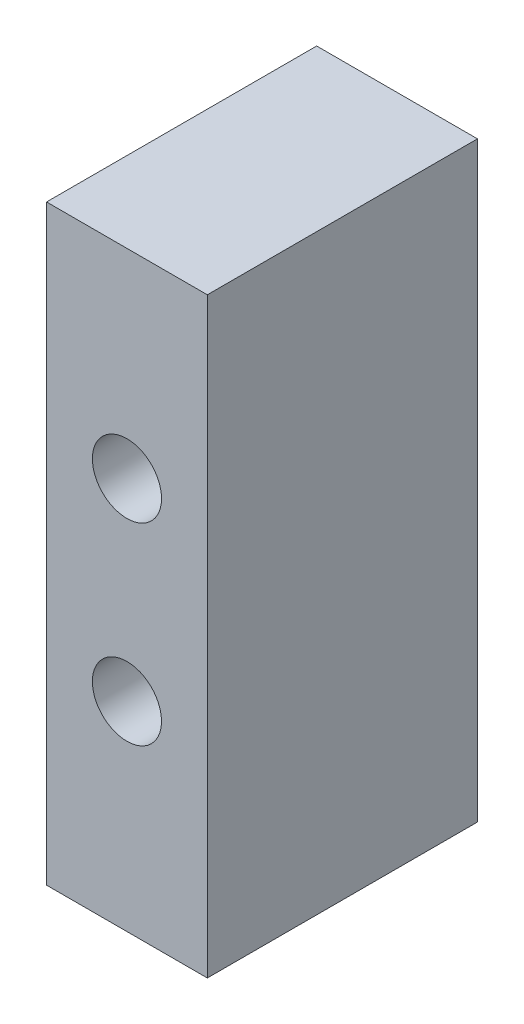
ISO-10303-21;
HEADER;
FILE_DESCRIPTION(('STEP AP214'),'2;1');
FILE_NAME('part.step','',(''),(''),'','','');
FILE_SCHEMA(('AUTOMOTIVE_DESIGN { 1 0 10303 214 1 1 1 1 }'));
ENDSEC;
DATA;
#1=APPLICATION_CONTEXT('core data for automotive mechanical design processes');
#2=APPLICATION_PROTOCOL_DEFINITION('international standard','automotive_design',2000,#1);
#3=PRODUCT_CONTEXT('',#1,'mechanical');
#4=PRODUCT('Part','Part','',(#3));
#5=PRODUCT_RELATED_PRODUCT_CATEGORY('part','',(#4));
#6=PRODUCT_DEFINITION_FORMATION('','',#4);
#7=PRODUCT_DEFINITION_CONTEXT('part definition',#1,'design');
#8=PRODUCT_DEFINITION('design','',#6,#7);
#9=PRODUCT_DEFINITION_SHAPE('','',#8);
#10=(LENGTH_UNIT() NAMED_UNIT(*) SI_UNIT(.MILLI.,.METRE.));
#11=(NAMED_UNIT(*) PLANE_ANGLE_UNIT() SI_UNIT($,.RADIAN.));
#12=(NAMED_UNIT(*) SI_UNIT($,.STERADIAN.) SOLID_ANGLE_UNIT());
#13=UNCERTAINTY_MEASURE_WITH_UNIT(LENGTH_MEASURE(1.E-05),#10,'distance_accuracy_value','');
#14=(GEOMETRIC_REPRESENTATION_CONTEXT(3) GLOBAL_UNCERTAINTY_ASSIGNED_CONTEXT((#13)) GLOBAL_UNIT_ASSIGNED_CONTEXT((#10,
#11,#12)) REPRESENTATION_CONTEXT('',''));
#15=CARTESIAN_POINT('',(0.,0.,0.));
#16=DIRECTION('',(0.,0.,1.));
#17=DIRECTION('',(1.,0.,0.));
#18=AXIS2_PLACEMENT_3D('',#15,#16,#17);
#19=CARTESIAN_POINT('',(0.,0.,16.8));
#20=DIRECTION('',(0.,0.,1.));
#21=DIRECTION('',(1.,0.,0.));
#22=AXIS2_PLACEMENT_3D('',#19,#20,#21);
#23=PLANE('',#22);
#24=CARTESIAN_POINT('',(0.,6.,16.8));
#25=DIRECTION('',(0.,0.,1.));
#26=DIRECTION('',(1.,0.,0.));
#27=AXIS2_PLACEMENT_3D('',#24,#25,#26);
#28=CIRCLE('',#27,2.15);
#29=CARTESIAN_POINT('',(2.15,6.,16.8));
#30=VERTEX_POINT('',#29);
#31=EDGE_CURVE('E108',#30,#30,#28,.T.);
#32=ORIENTED_EDGE('',*,*,#31,.F.);
#33=EDGE_LOOP('',(#32));
#34=FACE_BOUND('',#33,.T.);
#35=DIRECTION('',(0.,1.,0.));
#36=VECTOR('',#35,1.);
#37=CARTESIAN_POINT('',(5.,18.4,16.8));
#38=LINE('',#37,#36);
#39=CARTESIAN_POINT('',(5.,-18.4,16.8));
#40=VERTEX_POINT('',#39);
#41=CARTESIAN_POINT('',(5.,18.4,16.8));
#42=VERTEX_POINT('',#41);
#43=EDGE_CURVE('E93',#40,#42,#38,.T.);
#44=ORIENTED_EDGE('',*,*,#43,.T.);
#45=DIRECTION('',(-1.,0.,0.));
#46=VECTOR('',#45,1.);
#47=CARTESIAN_POINT('',(-5.,18.4,16.8));
#48=LINE('',#47,#46);
#49=CARTESIAN_POINT('',(-5.,18.4,16.8));
#50=VERTEX_POINT('',#49);
#51=EDGE_CURVE('E88',#42,#50,#48,.T.);
#52=ORIENTED_EDGE('',*,*,#51,.T.);
#53=DIRECTION('',(0.,-1.,0.));
#54=VECTOR('',#53,1.);
#55=CARTESIAN_POINT('',(-5.,18.4,16.8));
#56=LINE('',#55,#54);
#57=CARTESIAN_POINT('',(-5.,-18.4,16.8));
#58=VERTEX_POINT('',#57);
#59=EDGE_CURVE('E91',#50,#58,#56,.T.);
#60=ORIENTED_EDGE('',*,*,#59,.T.);
#61=DIRECTION('',(1.,0.,0.));
#62=VECTOR('',#61,1.);
#63=CARTESIAN_POINT('',(-5.,-18.4,16.8));
#64=LINE('',#63,#62);
#65=EDGE_CURVE('E58',#58,#40,#64,.T.);
#66=ORIENTED_EDGE('',*,*,#65,.T.);
#67=EDGE_LOOP('',(#44,#52,#60,#66));
#68=FACE_BOUND('',#67,.T.);
#69=CARTESIAN_POINT('',(0.,-6.,16.8));
#70=DIRECTION('',(0.,0.,1.));
#71=DIRECTION('',(-1.,0.,0.));
#72=AXIS2_PLACEMENT_3D('',#69,#70,#71);
#73=CIRCLE('',#72,2.15);
#74=CARTESIAN_POINT('',(-2.15,-6.,16.8));
#75=VERTEX_POINT('',#74);
#76=EDGE_CURVE('E123',#75,#75,#73,.T.);
#77=ORIENTED_EDGE('',*,*,#76,.F.);
#78=EDGE_LOOP('',(#77));
#79=FACE_BOUND('',#78,.T.);
#80=ADVANCED_FACE('F41',(#34,#68,#79),#23,.T.);
#81=CARTESIAN_POINT('',(0.,0.,0.));
#82=DIRECTION('',(0.,0.,1.));
#83=DIRECTION('',(1.,0.,0.));
#84=AXIS2_PLACEMENT_3D('',#81,#82,#83);
#85=PLANE('',#84);
#86=DIRECTION('',(0.,1.,0.));
#87=VECTOR('',#86,1.);
#88=CARTESIAN_POINT('',(5.,18.4,0.));
#89=LINE('',#88,#87);
#90=CARTESIAN_POINT('',(5.,-18.4,0.));
#91=VERTEX_POINT('',#90);
#92=CARTESIAN_POINT('',(5.,18.4,0.));
#93=VERTEX_POINT('',#92);
#94=EDGE_CURVE('E105',#91,#93,#89,.T.);
#95=ORIENTED_EDGE('',*,*,#94,.F.);
#96=DIRECTION('',(1.,0.,0.));
#97=VECTOR('',#96,1.);
#98=CARTESIAN_POINT('',(-5.,-18.4,0.));
#99=LINE('',#98,#97);
#100=CARTESIAN_POINT('',(-5.,-18.4,0.));
#101=VERTEX_POINT('',#100);
#102=EDGE_CURVE('E81',#101,#91,#99,.T.);
#103=ORIENTED_EDGE('',*,*,#102,.F.);
#104=DIRECTION('',(0.,-1.,0.));
#105=VECTOR('',#104,1.);
#106=CARTESIAN_POINT('',(-5.,18.4,0.));
#107=LINE('',#106,#105);
#108=CARTESIAN_POINT('',(-5.,18.4,0.));
#109=VERTEX_POINT('',#108);
#110=EDGE_CURVE('E75',#109,#101,#107,.T.);
#111=ORIENTED_EDGE('',*,*,#110,.F.);
#112=DIRECTION('',(-1.,0.,0.));
#113=VECTOR('',#112,1.);
#114=CARTESIAN_POINT('',(-5.,18.4,0.));
#115=LINE('',#114,#113);
#116=EDGE_CURVE('E97',#93,#109,#115,.T.);
#117=ORIENTED_EDGE('',*,*,#116,.F.);
#118=EDGE_LOOP('',(#95,#103,#111,#117));
#119=FACE_BOUND('',#118,.T.);
#120=CARTESIAN_POINT('',(0.,6.,0.));
#121=DIRECTION('',(0.,0.,1.));
#122=DIRECTION('',(1.,0.,0.));
#123=AXIS2_PLACEMENT_3D('',#120,#121,#122);
#124=CIRCLE('',#123,2.15);
#125=CARTESIAN_POINT('',(2.15,6.,0.));
#126=VERTEX_POINT('',#125);
#127=EDGE_CURVE('E120',#126,#126,#124,.T.);
#128=ORIENTED_EDGE('',*,*,#127,.T.);
#129=EDGE_LOOP('',(#128));
#130=FACE_BOUND('',#129,.T.);
#131=CARTESIAN_POINT('',(0.,-6.,0.));
#132=DIRECTION('',(0.,0.,1.));
#133=DIRECTION('',(-1.,0.,0.));
#134=AXIS2_PLACEMENT_3D('',#131,#132,#133);
#135=CIRCLE('',#134,2.15);
#136=CARTESIAN_POINT('',(-2.15,-6.,0.));
#137=VERTEX_POINT('',#136);
#138=EDGE_CURVE('E126',#137,#137,#135,.T.);
#139=ORIENTED_EDGE('',*,*,#138,.T.);
#140=EDGE_LOOP('',(#139));
#141=FACE_BOUND('',#140,.T.);
#142=ADVANCED_FACE('F116',(#119,#130,#141),#85,.F.);
#143=CARTESIAN_POINT('',(5.,18.4,16.8));
#144=DIRECTION('',(-1.,0.,0.));
#145=DIRECTION('',(0.,-1.,0.));
#146=AXIS2_PLACEMENT_3D('',#143,#144,#145);
#147=PLANE('',#146);
#148=ORIENTED_EDGE('',*,*,#94,.T.);
#149=DIRECTION('',(0.,0.,-1.));
#150=VECTOR('',#149,1.);
#151=CARTESIAN_POINT('',(5.,18.4,16.8));
#152=LINE('',#151,#150);
#153=EDGE_CURVE('E11',#42,#93,#152,.T.);
#154=ORIENTED_EDGE('',*,*,#153,.F.);
#155=ORIENTED_EDGE('',*,*,#43,.F.);
#156=DIRECTION('',(0.,0.,-1.));
#157=VECTOR('',#156,1.);
#158=CARTESIAN_POINT('',(5.,-18.4,16.8));
#159=LINE('',#158,#157);
#160=EDGE_CURVE('E101',#40,#91,#159,.T.);
#161=ORIENTED_EDGE('',*,*,#160,.T.);
#162=EDGE_LOOP('',(#148,#154,#155,#161));
#163=FACE_BOUND('',#162,.T.);
#164=ADVANCED_FACE('F43',(#163),#147,.F.);
#165=CARTESIAN_POINT('',(-5.,18.4,16.8));
#166=DIRECTION('',(0.,-1.,0.));
#167=DIRECTION('',(0.,0.,-1.));
#168=AXIS2_PLACEMENT_3D('',#165,#166,#167);
#169=PLANE('',#168);
#170=ORIENTED_EDGE('',*,*,#116,.T.);
#171=DIRECTION('',(0.,0.,-1.));
#172=VECTOR('',#171,1.);
#173=CARTESIAN_POINT('',(-5.,18.4,16.8));
#174=LINE('',#173,#172);
#175=EDGE_CURVE('E50',#50,#109,#174,.T.);
#176=ORIENTED_EDGE('',*,*,#175,.F.);
#177=ORIENTED_EDGE('',*,*,#51,.F.);
#178=ORIENTED_EDGE('',*,*,#153,.T.);
#179=EDGE_LOOP('',(#170,#176,#177,#178));
#180=FACE_BOUND('',#179,.T.);
#181=ADVANCED_FACE('F96',(#180),#169,.F.);
#182=CARTESIAN_POINT('',(-5.,18.4,16.8));
#183=DIRECTION('',(1.,0.,0.));
#184=DIRECTION('',(0.,1.,0.));
#185=AXIS2_PLACEMENT_3D('',#182,#183,#184);
#186=PLANE('',#185);
#187=ORIENTED_EDGE('',*,*,#110,.T.);
#188=DIRECTION('',(0.,0.,-1.));
#189=VECTOR('',#188,1.);
#190=CARTESIAN_POINT('',(-5.,-18.4,16.8));
#191=LINE('',#190,#189);
#192=EDGE_CURVE('E98',#58,#101,#191,.T.);
#193=ORIENTED_EDGE('',*,*,#192,.F.);
#194=ORIENTED_EDGE('',*,*,#59,.F.);
#195=ORIENTED_EDGE('',*,*,#175,.T.);
#196=EDGE_LOOP('',(#187,#193,#194,#195));
#197=FACE_BOUND('',#196,.T.);
#198=ADVANCED_FACE('F99',(#197),#186,.F.);
#199=CARTESIAN_POINT('',(-5.,-18.4,16.8));
#200=DIRECTION('',(0.,1.,0.));
#201=DIRECTION('',(0.,0.,1.));
#202=AXIS2_PLACEMENT_3D('',#199,#200,#201);
#203=PLANE('',#202);
#204=ORIENTED_EDGE('',*,*,#102,.T.);
#205=ORIENTED_EDGE('',*,*,#160,.F.);
#206=ORIENTED_EDGE('',*,*,#65,.F.);
#207=ORIENTED_EDGE('',*,*,#192,.T.);
#208=EDGE_LOOP('',(#204,#205,#206,#207));
#209=FACE_BOUND('',#208,.T.);
#210=ADVANCED_FACE('F113',(#209),#203,.F.);
#211=CARTESIAN_POINT('',(0.,6.,16.8));
#212=DIRECTION('',(0.,0.,-1.));
#213=DIRECTION('',(-1.,0.,0.));
#214=AXIS2_PLACEMENT_3D('',#211,#212,#213);
#215=CYLINDRICAL_SURFACE('',#214,2.15);
#216=ORIENTED_EDGE('',*,*,#31,.T.);
#217=EDGE_LOOP('',(#216));
#218=FACE_BOUND('',#217,.T.);
#219=ORIENTED_EDGE('',*,*,#127,.F.);
#220=EDGE_LOOP('',(#219));
#221=FACE_BOUND('',#220,.T.);
#222=ADVANCED_FACE('F143',(#218,#221),#215,.F.);
#223=CARTESIAN_POINT('',(0.,-6.,16.8));
#224=DIRECTION('',(0.,0.,-1.));
#225=DIRECTION('',(-1.,0.,0.));
#226=AXIS2_PLACEMENT_3D('',#223,#224,#225);
#227=CYLINDRICAL_SURFACE('',#226,2.15);
#228=ORIENTED_EDGE('',*,*,#76,.T.);
#229=EDGE_LOOP('',(#228));
#230=FACE_BOUND('',#229,.T.);
#231=ORIENTED_EDGE('',*,*,#138,.F.);
#232=EDGE_LOOP('',(#231));
#233=FACE_BOUND('',#232,.T.);
#234=ADVANCED_FACE('F132',(#230,#233),#227,.F.);
#235=CLOSED_SHELL('',(#80,#142,#164,#181,#198,#210,#222,#234));
#236=MANIFOLD_SOLID_BREP('B2',#235);
#237=ADVANCED_BREP_SHAPE_REPRESENTATION('',(#18,#236),#14);
#238=SHAPE_DEFINITION_REPRESENTATION(#9,#237);
ENDSEC;
END-ISO-10303-21;
